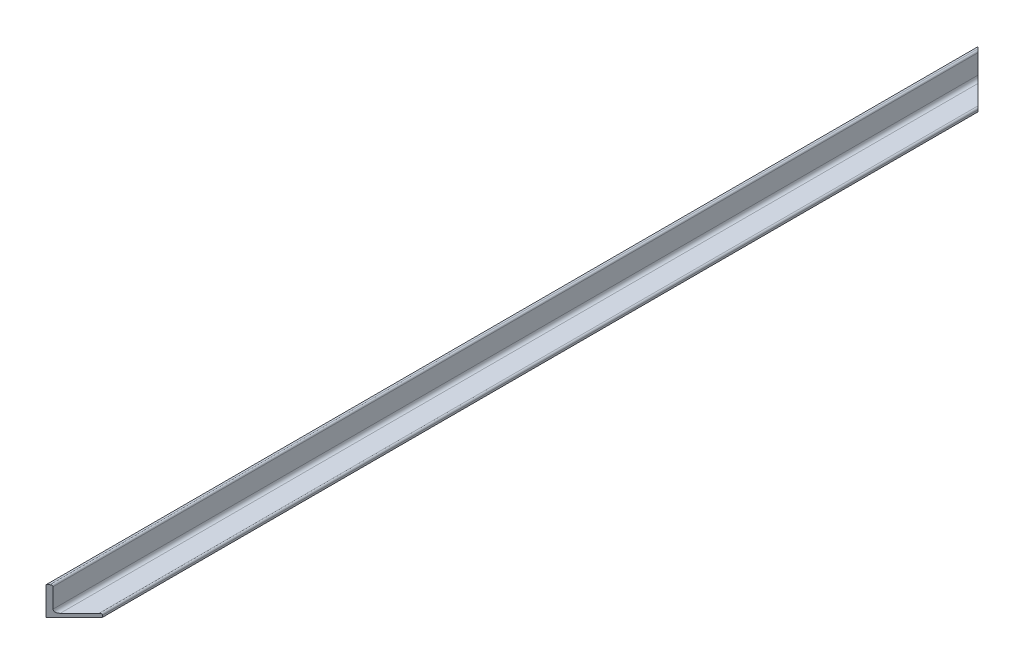
ISO-10303-21;
HEADER;
FILE_DESCRIPTION(('STEP AP214'),'2;1');
FILE_NAME('part.step','',(''),(''),'','','');
FILE_SCHEMA(('AUTOMOTIVE_DESIGN { 1 0 10303 214 1 1 1 1 }'));
ENDSEC;
DATA;
#1=APPLICATION_CONTEXT('core data for automotive mechanical design processes');
#2=APPLICATION_PROTOCOL_DEFINITION('international standard','automotive_design',2000,#1);
#3=PRODUCT_CONTEXT('',#1,'mechanical');
#4=PRODUCT('Part','Part','',(#3));
#5=PRODUCT_RELATED_PRODUCT_CATEGORY('part','',(#4));
#6=PRODUCT_DEFINITION_FORMATION('','',#4);
#7=PRODUCT_DEFINITION_CONTEXT('part definition',#1,'design');
#8=PRODUCT_DEFINITION('design','',#6,#7);
#9=PRODUCT_DEFINITION_SHAPE('','',#8);
#10=(LENGTH_UNIT() NAMED_UNIT(*) SI_UNIT(.MILLI.,.METRE.));
#11=(NAMED_UNIT(*) PLANE_ANGLE_UNIT() SI_UNIT($,.RADIAN.));
#12=(NAMED_UNIT(*) SI_UNIT($,.STERADIAN.) SOLID_ANGLE_UNIT());
#13=UNCERTAINTY_MEASURE_WITH_UNIT(LENGTH_MEASURE(1.E-05),#10,'distance_accuracy_value','');
#14=(GEOMETRIC_REPRESENTATION_CONTEXT(3) GLOBAL_UNCERTAINTY_ASSIGNED_CONTEXT((#13)) GLOBAL_UNIT_ASSIGNED_CONTEXT((#10,
#11,#12)) REPRESENTATION_CONTEXT('',''));
#15=CARTESIAN_POINT('',(0.,0.,0.));
#16=DIRECTION('',(0.,0.,1.));
#17=DIRECTION('',(1.,0.,0.));
#18=AXIS2_PLACEMENT_3D('',#15,#16,#17);
#19=CARTESIAN_POINT('',(-4.99999762E-08,0.,4.99999762E-08));
#20=DIRECTION('',(-0.707106781186547,0.,0.707106781186548));
#21=DIRECTION('',(0.707106781186548,0.,0.707106781186547));
#22=AXIS2_PLACEMENT_3D('',#19,#20,#21);
#23=PLANE('',#22);
#24=DIRECTION('',(-0.707106781186548,0.,-0.707106781186547));
#25=VECTOR('',#24,1.);
#26=CARTESIAN_POINT('',(2.4765,38.1,2.47650009999995));
#27=LINE('',#26,#25);
#28=CARTESIAN_POINT('',(2.4765,38.1,2.47650009999995));
#29=VERTEX_POINT('',#28);
#30=CARTESIAN_POINT('',(-1.22995654402062E-08,38.1,3.33697533511504E-08));
#31=VERTEX_POINT('',#30);
#32=EDGE_CURVE('E34',#29,#31,#27,.T.);
#33=ORIENTED_EDGE('',*,*,#32,.F.);
#34=CARTESIAN_POINT('',(2.4765,35.814,2.47650009999995));
#35=DIRECTION('',(-0.707106781186547,0.,0.707106781186548));
#36=DIRECTION('',(-0.707106781186548,0.,-0.707106781186547));
#37=AXIS2_PLACEMENT_3D('',#34,#35,#36);
#38=ELLIPSE('',#37,3.23289220358488,2.286);
#39=CARTESIAN_POINT('',(4.7625,35.814,4.76250009999995));
#40=VERTEX_POINT('',#39);
#41=EDGE_CURVE('E130',#40,#29,#38,.T.);
#42=ORIENTED_EDGE('',*,*,#41,.F.);
#43=DIRECTION('',(0.,1.,0.));
#44=VECTOR('',#43,1.);
#45=CARTESIAN_POINT('',(4.7625,9.5885,4.76250009999995));
#46=LINE('',#45,#44);
#47=CARTESIAN_POINT('',(4.7625,9.5885,4.76250009999995));
#48=VERTEX_POINT('',#47);
#49=EDGE_CURVE('E137',#48,#40,#46,.T.);
#50=ORIENTED_EDGE('',*,*,#49,.F.);
#51=CARTESIAN_POINT('',(9.5885,9.5885,9.58850009999995));
#52=DIRECTION('',(0.707106781186547,0.,-0.707106781186548));
#53=DIRECTION('',(-0.707106781186548,0.,-0.707106781186547));
#54=AXIS2_PLACEMENT_3D('',#51,#52,#53);
#55=ELLIPSE('',#54,6.82499465201256,4.826);
#56=CARTESIAN_POINT('',(9.5885,4.7625,9.58850009999995));
#57=VERTEX_POINT('',#56);
#58=EDGE_CURVE('E144',#57,#48,#55,.T.);
#59=ORIENTED_EDGE('',*,*,#58,.F.);
#60=DIRECTION('',(-0.707106781186548,0.,-0.707106781186547));
#61=VECTOR('',#60,1.);
#62=CARTESIAN_POINT('',(35.814,4.7625,35.8140001));
#63=LINE('',#62,#61);
#64=CARTESIAN_POINT('',(35.814,4.7625,35.8140001));
#65=VERTEX_POINT('',#64);
#66=EDGE_CURVE('E26',#65,#57,#63,.T.);
#67=ORIENTED_EDGE('',*,*,#66,.F.);
#68=CARTESIAN_POINT('',(35.814,2.47650000000003,35.8140001));
#69=DIRECTION('',(-0.707106781186547,0.,0.707106781186548));
#70=DIRECTION('',(-0.707106781186548,0.,-0.707106781186547));
#71=AXIS2_PLACEMENT_3D('',#68,#69,#70);
#72=ELLIPSE('',#71,3.23289220358491,2.286);
#73=CARTESIAN_POINT('',(38.1,2.47650000000003,38.1000001));
#74=VERTEX_POINT('',#73);
#75=EDGE_CURVE('E123',#74,#65,#72,.T.);
#76=ORIENTED_EDGE('',*,*,#75,.F.);
#77=DIRECTION('',(0.,1.,0.));
#78=VECTOR('',#77,1.);
#79=CARTESIAN_POINT('',(38.1,0.,38.1000000999999));
#80=LINE('',#79,#78);
#81=CARTESIAN_POINT('',(38.1,0.,38.1000001));
#82=VERTEX_POINT('',#81);
#83=EDGE_CURVE('E102',#82,#74,#80,.T.);
#84=ORIENTED_EDGE('',*,*,#83,.F.);
#85=DIRECTION('',(0.707106781186548,0.,0.707106781186547));
#86=VECTOR('',#85,1.);
#87=CARTESIAN_POINT('',(-4.99999773102231E-08,0.,4.9999975089777E-08));
#88=LINE('',#87,#86);
#89=CARTESIAN_POINT('',(-1.2299562351499E-08,0.,3.33697530782527E-08));
#90=VERTEX_POINT('',#89);
#91=EDGE_CURVE('E95',#90,#82,#88,.T.);
#92=ORIENTED_EDGE('',*,*,#91,.F.);
#93=DIRECTION('',(0.,1.,0.));
#94=VECTOR('',#93,1.);
#95=CARTESIAN_POINT('',(0.,0.,0.));
#96=LINE('',#95,#94);
#97=EDGE_CURVE('E10',#90,#31,#96,.T.);
#98=ORIENTED_EDGE('',*,*,#97,.T.);
#99=EDGE_LOOP('',(#33,#42,#50,#59,#67,#76,#84,#92,#98));
#100=FACE_BOUND('',#99,.T.);
#101=ADVANCED_FACE('F16',(#100),#23,.F.);
#102=CARTESIAN_POINT('',(9.5885,4.7625,0.));
#103=DIRECTION('',(0.,1.,0.));
#104=DIRECTION('',(0.,0.,1.));
#105=AXIS2_PLACEMENT_3D('',#102,#103,#104);
#106=PLANE('',#105);
#107=ORIENTED_EDGE('',*,*,#66,.T.);
#108=DIRECTION('',(0.,0.,1.));
#109=VECTOR('',#108,1.);
#110=CARTESIAN_POINT('',(9.5885,4.7625,9.58850009999995));
#111=LINE('',#110,#109);
#112=CARTESIAN_POINT('',(9.5885,4.7625,1247.7114999));
#113=VERTEX_POINT('',#112);
#114=EDGE_CURVE('E148',#57,#113,#111,.T.);
#115=ORIENTED_EDGE('',*,*,#114,.T.);
#116=DIRECTION('',(0.707106781186548,0.,-0.707106781186548));
#117=VECTOR('',#116,1.);
#118=CARTESIAN_POINT('',(9.58849999999962,4.7625,1247.7114999));
#119=LINE('',#118,#117);
#120=CARTESIAN_POINT('',(35.814,4.7625,1221.4859999));
#121=VERTEX_POINT('',#120);
#122=EDGE_CURVE('E146',#113,#121,#119,.T.);
#123=ORIENTED_EDGE('',*,*,#122,.T.);
#124=DIRECTION('',(0.,0.,1.));
#125=VECTOR('',#124,1.);
#126=CARTESIAN_POINT('',(35.814,4.7625,35.8140001));
#127=LINE('',#126,#125);
#128=EDGE_CURVE('E100',#65,#121,#127,.T.);
#129=ORIENTED_EDGE('',*,*,#128,.F.);
#130=EDGE_LOOP('',(#107,#115,#123,#129));
#131=FACE_BOUND('',#130,.T.);
#132=ADVANCED_FACE('F179',(#131),#106,.T.);
#133=CARTESIAN_POINT('',(9.5885,9.5885,0.));
#134=DIRECTION('',(0.,0.,1.));
#135=DIRECTION('',(1.,0.,0.));
#136=AXIS2_PLACEMENT_3D('',#133,#134,#135);
#137=CYLINDRICAL_SURFACE('',#136,4.826);
#138=ORIENTED_EDGE('',*,*,#58,.T.);
#139=DIRECTION('',(0.,0.,1.));
#140=VECTOR('',#139,1.);
#141=CARTESIAN_POINT('',(4.7625,9.5885,4.76250009999995));
#142=LINE('',#141,#140);
#143=CARTESIAN_POINT('',(4.7625,9.5885,1252.5374999));
#144=VERTEX_POINT('',#143);
#145=EDGE_CURVE('E141',#48,#144,#142,.T.);
#146=ORIENTED_EDGE('',*,*,#145,.T.);
#147=CARTESIAN_POINT('',(9.5885,9.5885,1247.7114999));
#148=DIRECTION('',(0.707106781186548,0.,0.707106781186548));
#149=DIRECTION('',(-0.707106781186548,0.,0.707106781186548));
#150=AXIS2_PLACEMENT_3D('',#147,#148,#149);
#151=ELLIPSE('',#150,6.82499465201256,4.826);
#152=EDGE_CURVE('E138',#144,#113,#151,.T.);
#153=ORIENTED_EDGE('',*,*,#152,.T.);
#154=ORIENTED_EDGE('',*,*,#114,.F.);
#155=EDGE_LOOP('',(#138,#146,#153,#154));
#156=FACE_BOUND('',#155,.T.);
#157=ADVANCED_FACE('F175',(#156),#137,.F.);
#158=CARTESIAN_POINT('',(4.7625,35.814,0.));
#159=DIRECTION('',(1.,0.,0.));
#160=DIRECTION('',(0.,0.,-1.));
#161=AXIS2_PLACEMENT_3D('',#158,#159,#160);
#162=PLANE('',#161);
#163=ORIENTED_EDGE('',*,*,#49,.T.);
#164=DIRECTION('',(0.,0.,1.));
#165=VECTOR('',#164,1.);
#166=CARTESIAN_POINT('',(4.7625,35.814,4.76250009999995));
#167=LINE('',#166,#165);
#168=CARTESIAN_POINT('',(4.7625,35.814,1252.5374999));
#169=VERTEX_POINT('',#168);
#170=EDGE_CURVE('E134',#40,#169,#167,.T.);
#171=ORIENTED_EDGE('',*,*,#170,.T.);
#172=DIRECTION('',(0.,-1.,0.));
#173=VECTOR('',#172,1.);
#174=CARTESIAN_POINT('',(4.7625,35.814,1252.5374999));
#175=LINE('',#174,#173);
#176=EDGE_CURVE('E131',#169,#144,#175,.T.);
#177=ORIENTED_EDGE('',*,*,#176,.T.);
#178=ORIENTED_EDGE('',*,*,#145,.F.);
#179=EDGE_LOOP('',(#163,#171,#177,#178));
#180=FACE_BOUND('',#179,.T.);
#181=ADVANCED_FACE('F173',(#180),#162,.T.);
#182=CARTESIAN_POINT('',(2.4765,35.814,0.));
#183=DIRECTION('',(0.,0.,1.));
#184=DIRECTION('',(1.,0.,0.));
#185=AXIS2_PLACEMENT_3D('',#182,#183,#184);
#186=CYLINDRICAL_SURFACE('',#185,2.286);
#187=ORIENTED_EDGE('',*,*,#41,.T.);
#188=DIRECTION('',(0.,0.,1.));
#189=VECTOR('',#188,1.);
#190=CARTESIAN_POINT('',(2.4765,38.1,2.47650009999995));
#191=LINE('',#190,#189);
#192=CARTESIAN_POINT('',(2.4765,38.1,1254.8234999));
#193=VERTEX_POINT('',#192);
#194=EDGE_CURVE('E127',#29,#193,#191,.T.);
#195=ORIENTED_EDGE('',*,*,#194,.T.);
#196=CARTESIAN_POINT('',(2.4765,35.814,1254.8234999));
#197=DIRECTION('',(-0.707106781186548,0.,-0.707106781186548));
#198=DIRECTION('',(-0.707106781186548,0.,0.707106781186548));
#199=AXIS2_PLACEMENT_3D('',#196,#197,#198);
#200=ELLIPSE('',#199,3.23289220358491,2.286);
#201=EDGE_CURVE('E124',#193,#169,#200,.T.);
#202=ORIENTED_EDGE('',*,*,#201,.T.);
#203=ORIENTED_EDGE('',*,*,#170,.F.);
#204=EDGE_LOOP('',(#187,#195,#202,#203));
#205=FACE_BOUND('',#204,.T.);
#206=ADVANCED_FACE('F170',(#205),#186,.T.);
#207=CARTESIAN_POINT('',(628.64999995,0.,628.64999995));
#208=DIRECTION('',(-0.707106781186548,0.,-0.707106781186548));
#209=DIRECTION('',(-0.707106781186548,0.,0.707106781186548));
#210=AXIS2_PLACEMENT_3D('',#207,#208,#209);
#211=PLANE('',#210);
#212=ORIENTED_EDGE('',*,*,#122,.F.);
#213=ORIENTED_EDGE('',*,*,#152,.F.);
#214=ORIENTED_EDGE('',*,*,#176,.F.);
#215=ORIENTED_EDGE('',*,*,#201,.F.);
#216=DIRECTION('',(0.707106781186558,0.,-0.707106781186537));
#217=VECTOR('',#216,1.);
#218=CARTESIAN_POINT('',(-5.00003504939302E-08,38.1,1257.29999995));
#219=LINE('',#218,#217);
#220=CARTESIAN_POINT('',(-1.22996344571059E-08,38.1,1257.29999996663));
#221=VERTEX_POINT('',#220);
#222=EDGE_CURVE('E120',#221,#193,#219,.T.);
#223=ORIENTED_EDGE('',*,*,#222,.F.);
#224=DIRECTION('',(0.,1.,0.));
#225=VECTOR('',#224,1.);
#226=CARTESIAN_POINT('',(0.,0.,1257.3));
#227=LINE('',#226,#225);
#228=CARTESIAN_POINT('',(-1.22996115144621E-08,0.,1257.29999996663));
#229=VERTEX_POINT('',#228);
#230=EDGE_CURVE('E114',#229,#221,#227,.T.);
#231=ORIENTED_EDGE('',*,*,#230,.F.);
#232=DIRECTION('',(-0.707106781186548,0.,0.707106781186547));
#233=VECTOR('',#232,1.);
#234=CARTESIAN_POINT('',(38.1,0.,1219.1999999));
#235=LINE('',#234,#233);
#236=CARTESIAN_POINT('',(38.1,0.,1219.1999999));
#237=VERTEX_POINT('',#236);
#238=EDGE_CURVE('E83',#237,#229,#235,.T.);
#239=ORIENTED_EDGE('',*,*,#238,.F.);
#240=DIRECTION('',(0.,-1.,0.));
#241=VECTOR('',#240,1.);
#242=CARTESIAN_POINT('',(38.1,2.47650000000003,1219.1999999));
#243=LINE('',#242,#241);
#244=CARTESIAN_POINT('',(38.1,2.47650000000003,1219.1999999));
#245=VERTEX_POINT('',#244);
#246=EDGE_CURVE('E86',#245,#237,#243,.T.);
#247=ORIENTED_EDGE('',*,*,#246,.F.);
#248=CARTESIAN_POINT('',(35.814,2.47650000000003,1221.4859999));
#249=DIRECTION('',(-0.707106781186548,0.,-0.707106781186548));
#250=DIRECTION('',(-0.707106781186548,0.,0.707106781186548));
#251=AXIS2_PLACEMENT_3D('',#248,#249,#250);
#252=ELLIPSE('',#251,3.23289220358491,2.286);
#253=EDGE_CURVE('E89',#121,#245,#252,.T.);
#254=ORIENTED_EDGE('',*,*,#253,.F.);
#255=EDGE_LOOP('',(#212,#213,#214,#215,#223,#231,#239,#247,#254));
#256=FACE_BOUND('',#255,.T.);
#257=ADVANCED_FACE('F88',(#256),#211,.F.);
#258=CARTESIAN_POINT('',(0.,38.1,0.));
#259=DIRECTION('',(0.,1.,0.));
#260=DIRECTION('',(0.,0.,1.));
#261=AXIS2_PLACEMENT_3D('',#258,#259,#260);
#262=PLANE('',#261);
#263=ORIENTED_EDGE('',*,*,#32,.T.);
#264=DIRECTION('',(0.,0.,1.));
#265=VECTOR('',#264,1.);
#266=CARTESIAN_POINT('',(0.,38.1,0.));
#267=LINE('',#266,#265);
#268=EDGE_CURVE('E110',#31,#221,#267,.T.);
#269=ORIENTED_EDGE('',*,*,#268,.T.);
#270=ORIENTED_EDGE('',*,*,#222,.T.);
#271=ORIENTED_EDGE('',*,*,#194,.F.);
#272=EDGE_LOOP('',(#263,#269,#270,#271));
#273=FACE_BOUND('',#272,.T.);
#274=ADVANCED_FACE('F163',(#273),#262,.T.);
#275=CARTESIAN_POINT('',(35.814,2.47650000000003,0.));
#276=DIRECTION('',(0.,0.,1.));
#277=DIRECTION('',(1.,0.,0.));
#278=AXIS2_PLACEMENT_3D('',#275,#276,#277);
#279=CYLINDRICAL_SURFACE('',#278,2.286);
#280=ORIENTED_EDGE('',*,*,#75,.T.);
#281=ORIENTED_EDGE('',*,*,#128,.T.);
#282=ORIENTED_EDGE('',*,*,#253,.T.);
#283=DIRECTION('',(0.,0.,1.));
#284=VECTOR('',#283,1.);
#285=CARTESIAN_POINT('',(38.1,2.47650000000003,38.1000001));
#286=LINE('',#285,#284);
#287=EDGE_CURVE('E94',#74,#245,#286,.T.);
#288=ORIENTED_EDGE('',*,*,#287,.F.);
#289=EDGE_LOOP('',(#280,#281,#282,#288));
#290=FACE_BOUND('',#289,.T.);
#291=ADVANCED_FACE('F18',(#290),#279,.T.);
#292=CARTESIAN_POINT('',(38.1,2.47650000000003,0.));
#293=DIRECTION('',(1.,0.,0.));
#294=DIRECTION('',(0.,0.,-1.));
#295=AXIS2_PLACEMENT_3D('',#292,#293,#294);
#296=PLANE('',#295);
#297=ORIENTED_EDGE('',*,*,#83,.T.);
#298=ORIENTED_EDGE('',*,*,#287,.T.);
#299=ORIENTED_EDGE('',*,*,#246,.T.);
#300=DIRECTION('',(0.,0.,1.));
#301=VECTOR('',#300,1.);
#302=CARTESIAN_POINT('',(38.1,0.,38.1000001));
#303=LINE('',#302,#301);
#304=EDGE_CURVE('E111',#82,#237,#303,.T.);
#305=ORIENTED_EDGE('',*,*,#304,.F.);
#306=EDGE_LOOP('',(#297,#298,#299,#305));
#307=FACE_BOUND('',#306,.T.);
#308=ADVANCED_FACE('F104',(#307),#296,.T.);
#309=CARTESIAN_POINT('',(38.1,0.,0.));
#310=DIRECTION('',(0.,-1.,0.));
#311=DIRECTION('',(0.,0.,-1.));
#312=AXIS2_PLACEMENT_3D('',#309,#310,#311);
#313=PLANE('',#312);
#314=ORIENTED_EDGE('',*,*,#91,.T.);
#315=ORIENTED_EDGE('',*,*,#304,.T.);
#316=ORIENTED_EDGE('',*,*,#238,.T.);
#317=DIRECTION('',(0.,0.,1.));
#318=VECTOR('',#317,1.);
#319=CARTESIAN_POINT('',(0.,0.,0.));
#320=LINE('',#319,#318);
#321=EDGE_CURVE('E20',#90,#229,#320,.T.);
#322=ORIENTED_EDGE('',*,*,#321,.F.);
#323=EDGE_LOOP('',(#314,#315,#316,#322));
#324=FACE_BOUND('',#323,.T.);
#325=ADVANCED_FACE('F198',(#324),#313,.T.);
#326=CARTESIAN_POINT('',(0.,0.,0.));
#327=DIRECTION('',(-1.,0.,0.));
#328=DIRECTION('',(0.,0.,1.));
#329=AXIS2_PLACEMENT_3D('',#326,#327,#328);
#330=PLANE('',#329);
#331=ORIENTED_EDGE('',*,*,#230,.T.);
#332=ORIENTED_EDGE('',*,*,#268,.F.);
#333=ORIENTED_EDGE('',*,*,#97,.F.);
#334=ORIENTED_EDGE('',*,*,#321,.T.);
#335=EDGE_LOOP('',(#331,#332,#333,#334));
#336=FACE_BOUND('',#335,.T.);
#337=ADVANCED_FACE('F167',(#336),#330,.T.);
#338=CLOSED_SHELL('',(#101,#132,#157,#181,#206,#257,#274,#291,#308,#325,#337));
#339=MANIFOLD_SOLID_BREP('B1',#338);
#340=ADVANCED_BREP_SHAPE_REPRESENTATION('',(#18,#339),#14);
#341=SHAPE_DEFINITION_REPRESENTATION(#9,#340);
ENDSEC;
END-ISO-10303-21;
